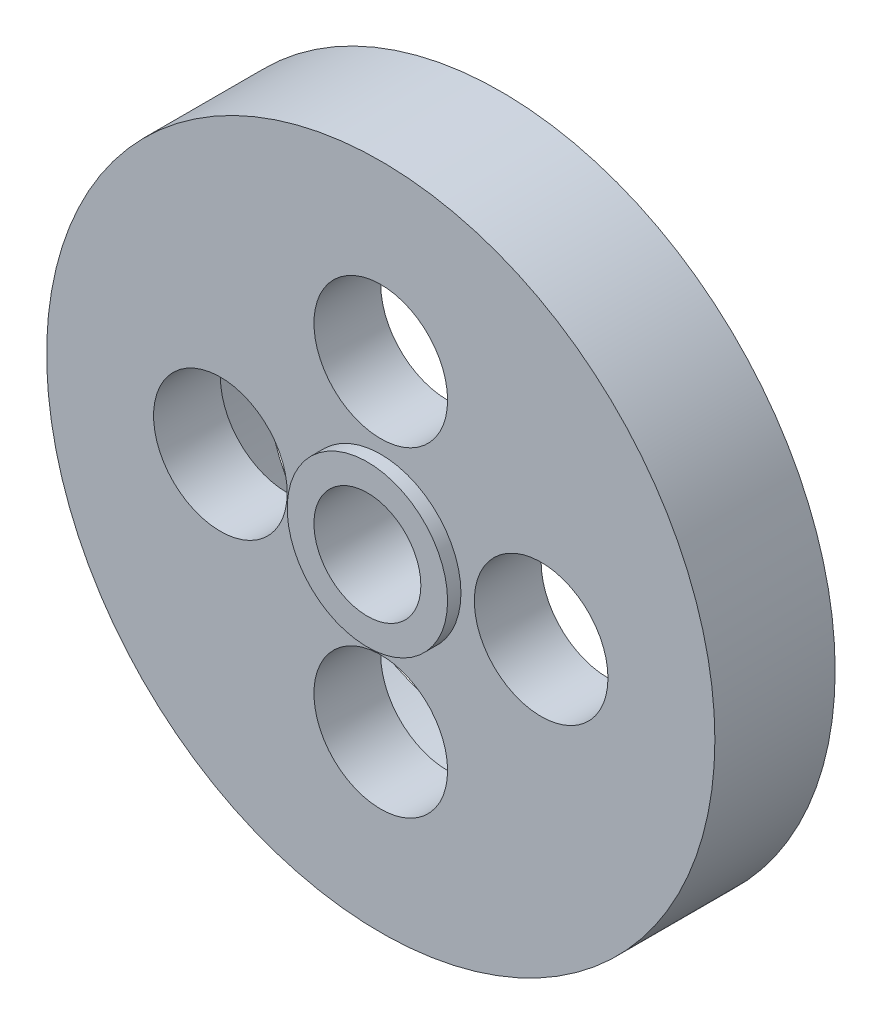
ISO-10303-21;
HEADER;
FILE_DESCRIPTION(('STEP AP214'),'2;1');
FILE_NAME('part.step','',(''),(''),'','','');
FILE_SCHEMA(('AUTOMOTIVE_DESIGN { 1 0 10303 214 1 1 1 1 }'));
ENDSEC;
DATA;
#1=APPLICATION_CONTEXT('core data for automotive mechanical design processes');
#2=APPLICATION_PROTOCOL_DEFINITION('international standard','automotive_design',2000,#1);
#3=PRODUCT_CONTEXT('',#1,'mechanical');
#4=PRODUCT('Part','Part','',(#3));
#5=PRODUCT_RELATED_PRODUCT_CATEGORY('part','',(#4));
#6=PRODUCT_DEFINITION_FORMATION('','',#4);
#7=PRODUCT_DEFINITION_CONTEXT('part definition',#1,'design');
#8=PRODUCT_DEFINITION('design','',#6,#7);
#9=PRODUCT_DEFINITION_SHAPE('','',#8);
#10=(LENGTH_UNIT() NAMED_UNIT(*) SI_UNIT(.MILLI.,.METRE.));
#11=(NAMED_UNIT(*) PLANE_ANGLE_UNIT() SI_UNIT($,.RADIAN.));
#12=(NAMED_UNIT(*) SI_UNIT($,.STERADIAN.) SOLID_ANGLE_UNIT());
#13=UNCERTAINTY_MEASURE_WITH_UNIT(LENGTH_MEASURE(1.E-05),#10,'distance_accuracy_value','');
#14=(GEOMETRIC_REPRESENTATION_CONTEXT(3) GLOBAL_UNCERTAINTY_ASSIGNED_CONTEXT((#13)) GLOBAL_UNIT_ASSIGNED_CONTEXT((#10,
#11,#12)) REPRESENTATION_CONTEXT('',''));
#15=CARTESIAN_POINT('',(0.,0.,0.));
#16=DIRECTION('',(0.,0.,1.));
#17=DIRECTION('',(1.,0.,0.));
#18=AXIS2_PLACEMENT_3D('',#15,#16,#17);
#19=CARTESIAN_POINT('',(0.,0.,-9.));
#20=DIRECTION('',(0.,0.,1.));
#21=DIRECTION('',(1.,0.,0.));
#22=AXIS2_PLACEMENT_3D('',#19,#20,#21);
#23=CYLINDRICAL_SURFACE('',#22,4.);
#24=CARTESIAN_POINT('',(0.,0.,1.));
#25=DIRECTION('',(0.,0.,1.));
#26=DIRECTION('',(1.,0.,0.));
#27=AXIS2_PLACEMENT_3D('',#24,#25,#26);
#28=CIRCLE('',#27,4.);
#29=CARTESIAN_POINT('',(4.,0.,1.));
#30=VERTEX_POINT('',#29);
#31=EDGE_CURVE('E88',#30,#30,#28,.T.);
#32=ORIENTED_EDGE('',*,*,#31,.T.);
#33=EDGE_LOOP('',(#32));
#34=FACE_BOUND('',#33,.T.);
#35=CARTESIAN_POINT('',(0.,0.,-5.));
#36=DIRECTION('',(0.,0.,-1.));
#37=DIRECTION('',(-1.,0.,0.));
#38=AXIS2_PLACEMENT_3D('',#35,#36,#37);
#39=CIRCLE('',#38,4.);
#40=CARTESIAN_POINT('',(-4.,0.,-5.));
#41=VERTEX_POINT('',#40);
#42=EDGE_CURVE('E93',#41,#41,#39,.T.);
#43=ORIENTED_EDGE('',*,*,#42,.T.);
#44=EDGE_LOOP('',(#43));
#45=FACE_BOUND('',#44,.T.);
#46=ADVANCED_FACE('F43',(#34,#45),#23,.F.);
#47=CARTESIAN_POINT('',(0.,0.,0.));
#48=DIRECTION('',(0.,0.,1.));
#49=DIRECTION('',(1.,0.,0.));
#50=AXIS2_PLACEMENT_3D('',#47,#48,#49);
#51=PLANE('',#50);
#52=CARTESIAN_POINT('',(0.,0.,0.));
#53=DIRECTION('',(0.,0.,1.));
#54=DIRECTION('',(1.,0.,0.));
#55=AXIS2_PLACEMENT_3D('',#52,#53,#54);
#56=CIRCLE('',#55,25.);
#57=CARTESIAN_POINT('',(25.,0.,0.));
#58=VERTEX_POINT('',#57);
#59=EDGE_CURVE('E51',#58,#58,#56,.T.);
#60=ORIENTED_EDGE('',*,*,#59,.T.);
#61=EDGE_LOOP('',(#60));
#62=FACE_BOUND('',#61,.T.);
#63=CARTESIAN_POINT('',(0.,12.,0.));
#64=DIRECTION('',(0.,0.,1.));
#65=DIRECTION('',(1.,0.,0.));
#66=AXIS2_PLACEMENT_3D('',#63,#64,#65);
#67=CIRCLE('',#66,5.);
#68=CARTESIAN_POINT('',(5.,12.,0.));
#69=VERTEX_POINT('',#68);
#70=EDGE_CURVE('E56',#69,#69,#67,.T.);
#71=ORIENTED_EDGE('',*,*,#70,.F.);
#72=EDGE_LOOP('',(#71));
#73=FACE_BOUND('',#72,.T.);
#74=CARTESIAN_POINT('',(12.,0.,0.));
#75=DIRECTION('',(0.,0.,1.));
#76=DIRECTION('',(1.,0.,0.));
#77=AXIS2_PLACEMENT_3D('',#74,#75,#76);
#78=CIRCLE('',#77,5.);
#79=CARTESIAN_POINT('',(17.,0.,0.));
#80=VERTEX_POINT('',#79);
#81=EDGE_CURVE('E60',#80,#80,#78,.T.);
#82=ORIENTED_EDGE('',*,*,#81,.F.);
#83=EDGE_LOOP('',(#82));
#84=FACE_BOUND('',#83,.T.);
#85=CARTESIAN_POINT('',(0.,-12.,0.));
#86=DIRECTION('',(0.,0.,1.));
#87=DIRECTION('',(1.,0.,0.));
#88=AXIS2_PLACEMENT_3D('',#85,#86,#87);
#89=CIRCLE('',#88,5.);
#90=CARTESIAN_POINT('',(4.99999999999992,-12.,0.));
#91=VERTEX_POINT('',#90);
#92=EDGE_CURVE('E63',#91,#91,#89,.T.);
#93=ORIENTED_EDGE('',*,*,#92,.F.);
#94=EDGE_LOOP('',(#93));
#95=FACE_BOUND('',#94,.T.);
#96=CARTESIAN_POINT('',(-12.,1.25693328198353E-13,0.));
#97=DIRECTION('',(0.,0.,1.));
#98=DIRECTION('',(1.,0.,0.));
#99=AXIS2_PLACEMENT_3D('',#96,#97,#98);
#100=CIRCLE('',#99,5.);
#101=CARTESIAN_POINT('',(-7.,1.25693328198353E-13,0.));
#102=VERTEX_POINT('',#101);
#103=EDGE_CURVE('E66',#102,#102,#100,.T.);
#104=ORIENTED_EDGE('',*,*,#103,.F.);
#105=EDGE_LOOP('',(#104));
#106=FACE_BOUND('',#105,.T.);
#107=CARTESIAN_POINT('',(0.,0.,0.));
#108=DIRECTION('',(0.,0.,1.));
#109=DIRECTION('',(1.,0.,0.));
#110=AXIS2_PLACEMENT_3D('',#107,#108,#109);
#111=CIRCLE('',#110,6.);
#112=CARTESIAN_POINT('',(6.,0.,0.));
#113=VERTEX_POINT('',#112);
#114=EDGE_CURVE('E85',#113,#113,#111,.T.);
#115=ORIENTED_EDGE('',*,*,#114,.F.);
#116=EDGE_LOOP('',(#115));
#117=FACE_BOUND('',#116,.T.);
#118=ADVANCED_FACE('F117',(#62,#73,#84,#95,#106,#117),#51,.T.);
#119=CARTESIAN_POINT('',(0.,12.,-9.));
#120=DIRECTION('',(0.,0.,1.));
#121=DIRECTION('',(1.,0.,0.));
#122=AXIS2_PLACEMENT_3D('',#119,#120,#121);
#123=CYLINDRICAL_SURFACE('',#122,5.);
#124=ORIENTED_EDGE('',*,*,#70,.T.);
#125=EDGE_LOOP('',(#124));
#126=FACE_BOUND('',#125,.T.);
#127=CARTESIAN_POINT('',(0.,12.,-5.));
#128=DIRECTION('',(0.,0.,-1.));
#129=DIRECTION('',(-1.,0.,0.));
#130=AXIS2_PLACEMENT_3D('',#127,#128,#129);
#131=CIRCLE('',#130,5.);
#132=CARTESIAN_POINT('',(-5.,12.,-5.));
#133=VERTEX_POINT('',#132);
#134=EDGE_CURVE('E69',#133,#133,#131,.F.);
#135=ORIENTED_EDGE('',*,*,#134,.F.);
#136=EDGE_LOOP('',(#135));
#137=FACE_BOUND('',#136,.T.);
#138=ADVANCED_FACE('F124',(#126,#137),#123,.F.);
#139=CARTESIAN_POINT('',(12.,0.,-9.));
#140=DIRECTION('',(0.,0.,1.));
#141=DIRECTION('',(1.,0.,0.));
#142=AXIS2_PLACEMENT_3D('',#139,#140,#141);
#143=CYLINDRICAL_SURFACE('',#142,5.);
#144=ORIENTED_EDGE('',*,*,#81,.T.);
#145=EDGE_LOOP('',(#144));
#146=FACE_BOUND('',#145,.T.);
#147=CARTESIAN_POINT('',(12.,0.,-5.));
#148=DIRECTION('',(0.,0.,-1.));
#149=DIRECTION('',(-1.,0.,0.));
#150=AXIS2_PLACEMENT_3D('',#147,#148,#149);
#151=CIRCLE('',#150,5.);
#152=CARTESIAN_POINT('',(7.,0.,-5.));
#153=VERTEX_POINT('',#152);
#154=EDGE_CURVE('E72',#153,#153,#151,.F.);
#155=ORIENTED_EDGE('',*,*,#154,.F.);
#156=EDGE_LOOP('',(#155));
#157=FACE_BOUND('',#156,.T.);
#158=ADVANCED_FACE('F129',(#146,#157),#143,.F.);
#159=CARTESIAN_POINT('',(0.,-12.,-9.));
#160=DIRECTION('',(0.,0.,1.));
#161=DIRECTION('',(1.,0.,0.));
#162=AXIS2_PLACEMENT_3D('',#159,#160,#161);
#163=CYLINDRICAL_SURFACE('',#162,5.);
#164=ORIENTED_EDGE('',*,*,#92,.T.);
#165=EDGE_LOOP('',(#164));
#166=FACE_BOUND('',#165,.T.);
#167=CARTESIAN_POINT('',(0.,-12.,-5.));
#168=DIRECTION('',(0.,0.,-1.));
#169=DIRECTION('',(-1.,0.,0.));
#170=AXIS2_PLACEMENT_3D('',#167,#168,#169);
#171=CIRCLE('',#170,5.);
#172=CARTESIAN_POINT('',(-5.00000000000008,-12.,-5.));
#173=VERTEX_POINT('',#172);
#174=EDGE_CURVE('E75',#173,#173,#171,.F.);
#175=ORIENTED_EDGE('',*,*,#174,.F.);
#176=EDGE_LOOP('',(#175));
#177=FACE_BOUND('',#176,.T.);
#178=ADVANCED_FACE('F133',(#166,#177),#163,.F.);
#179=CARTESIAN_POINT('',(-12.,1.25693328198353E-13,-9.));
#180=DIRECTION('',(0.,0.,1.));
#181=DIRECTION('',(1.,0.,0.));
#182=AXIS2_PLACEMENT_3D('',#179,#180,#181);
#183=CYLINDRICAL_SURFACE('',#182,5.);
#184=ORIENTED_EDGE('',*,*,#103,.T.);
#185=EDGE_LOOP('',(#184));
#186=FACE_BOUND('',#185,.T.);
#187=CARTESIAN_POINT('',(-12.,1.25693328198353E-13,-5.));
#188=DIRECTION('',(0.,0.,-1.));
#189=DIRECTION('',(-1.,0.,0.));
#190=AXIS2_PLACEMENT_3D('',#187,#188,#189);
#191=CIRCLE('',#190,5.);
#192=CARTESIAN_POINT('',(-17.,1.25693328198353E-13,-5.));
#193=VERTEX_POINT('',#192);
#194=EDGE_CURVE('E47',#193,#193,#191,.F.);
#195=ORIENTED_EDGE('',*,*,#194,.F.);
#196=EDGE_LOOP('',(#195));
#197=FACE_BOUND('',#196,.T.);
#198=ADVANCED_FACE('F137',(#186,#197),#183,.F.);
#199=CARTESIAN_POINT('',(0.,0.,-9.));
#200=DIRECTION('',(0.,0.,1.));
#201=DIRECTION('',(1.,0.,0.));
#202=AXIS2_PLACEMENT_3D('',#199,#200,#201);
#203=CYLINDRICAL_SURFACE('',#202,25.);
#204=CARTESIAN_POINT('',(0.,0.,-9.));
#205=DIRECTION('',(0.,0.,1.));
#206=DIRECTION('',(1.,0.,0.));
#207=AXIS2_PLACEMENT_3D('',#204,#205,#206);
#208=CIRCLE('',#207,25.);
#209=CARTESIAN_POINT('',(25.,0.,-9.));
#210=VERTEX_POINT('',#209);
#211=EDGE_CURVE('E10',#210,#210,#208,.T.);
#212=ORIENTED_EDGE('',*,*,#211,.T.);
#213=EDGE_LOOP('',(#212));
#214=FACE_BOUND('',#213,.T.);
#215=ORIENTED_EDGE('',*,*,#59,.F.);
#216=EDGE_LOOP('',(#215));
#217=FACE_BOUND('',#216,.T.);
#218=ADVANCED_FACE('F45',(#214,#217),#203,.T.);
#219=CARTESIAN_POINT('',(0.,0.,-9.));
#220=DIRECTION('',(0.,0.,1.));
#221=DIRECTION('',(1.,0.,0.));
#222=AXIS2_PLACEMENT_3D('',#219,#220,#221);
#223=PLANE('',#222);
#224=CARTESIAN_POINT('',(0.,0.,-9.));
#225=DIRECTION('',(0.,0.,-1.));
#226=DIRECTION('',(-1.,0.,0.));
#227=AXIS2_PLACEMENT_3D('',#224,#225,#226);
#228=CIRCLE('',#227,18.);
#229=CARTESIAN_POINT('',(-18.,0.,-9.));
#230=VERTEX_POINT('',#229);
#231=EDGE_CURVE('E78',#230,#230,#228,.T.);
#232=ORIENTED_EDGE('',*,*,#231,.F.);
#233=EDGE_LOOP('',(#232));
#234=FACE_BOUND('',#233,.T.);
#235=ORIENTED_EDGE('',*,*,#211,.F.);
#236=EDGE_LOOP('',(#235));
#237=FACE_BOUND('',#236,.T.);
#238=ADVANCED_FACE('F101',(#234,#237),#223,.F.);
#239=CARTESIAN_POINT('',(0.,0.,-5.));
#240=DIRECTION('',(0.,0.,-1.));
#241=DIRECTION('',(-1.,0.,0.));
#242=AXIS2_PLACEMENT_3D('',#239,#240,#241);
#243=PLANE('',#242);
#244=CARTESIAN_POINT('',(0.,0.,-5.));
#245=DIRECTION('',(0.,0.,-1.));
#246=DIRECTION('',(-1.,0.,0.));
#247=AXIS2_PLACEMENT_3D('',#244,#245,#246);
#248=CIRCLE('',#247,18.);
#249=CARTESIAN_POINT('',(-18.,0.,-5.));
#250=VERTEX_POINT('',#249);
#251=EDGE_CURVE('E81',#250,#250,#248,.T.);
#252=ORIENTED_EDGE('',*,*,#251,.T.);
#253=EDGE_LOOP('',(#252));
#254=FACE_BOUND('',#253,.T.);
#255=ORIENTED_EDGE('',*,*,#194,.T.);
#256=EDGE_LOOP('',(#255));
#257=FACE_BOUND('',#256,.T.);
#258=ORIENTED_EDGE('',*,*,#174,.T.);
#259=EDGE_LOOP('',(#258));
#260=FACE_BOUND('',#259,.T.);
#261=ORIENTED_EDGE('',*,*,#154,.T.);
#262=EDGE_LOOP('',(#261));
#263=FACE_BOUND('',#262,.T.);
#264=ORIENTED_EDGE('',*,*,#134,.T.);
#265=EDGE_LOOP('',(#264));
#266=FACE_BOUND('',#265,.T.);
#267=ORIENTED_EDGE('',*,*,#42,.F.);
#268=EDGE_LOOP('',(#267));
#269=FACE_BOUND('',#268,.T.);
#270=ADVANCED_FACE('F98',(#254,#257,#260,#263,#266,#269),#243,.T.);
#271=CARTESIAN_POINT('',(0.,0.,-5.));
#272=DIRECTION('',(0.,0.,-1.));
#273=DIRECTION('',(-1.,0.,0.));
#274=AXIS2_PLACEMENT_3D('',#271,#272,#273);
#275=CYLINDRICAL_SURFACE('',#274,18.);
#276=ORIENTED_EDGE('',*,*,#251,.F.);
#277=EDGE_LOOP('',(#276));
#278=FACE_BOUND('',#277,.T.);
#279=ORIENTED_EDGE('',*,*,#231,.T.);
#280=EDGE_LOOP('',(#279));
#281=FACE_BOUND('',#280,.T.);
#282=ADVANCED_FACE('F100',(#278,#281),#275,.F.);
#283=CARTESIAN_POINT('',(0.,0.,1.));
#284=DIRECTION('',(0.,0.,1.));
#285=DIRECTION('',(1.,0.,0.));
#286=AXIS2_PLACEMENT_3D('',#283,#284,#285);
#287=PLANE('',#286);
#288=CARTESIAN_POINT('',(0.,0.,1.));
#289=DIRECTION('',(0.,0.,1.));
#290=DIRECTION('',(1.,0.,0.));
#291=AXIS2_PLACEMENT_3D('',#288,#289,#290);
#292=CIRCLE('',#291,6.);
#293=CARTESIAN_POINT('',(6.,0.,1.));
#294=VERTEX_POINT('',#293);
#295=EDGE_CURVE('E82',#294,#294,#292,.T.);
#296=ORIENTED_EDGE('',*,*,#295,.T.);
#297=EDGE_LOOP('',(#296));
#298=FACE_BOUND('',#297,.T.);
#299=ORIENTED_EDGE('',*,*,#31,.F.);
#300=EDGE_LOOP('',(#299));
#301=FACE_BOUND('',#300,.T.);
#302=ADVANCED_FACE('F108',(#298,#301),#287,.T.);
#303=CARTESIAN_POINT('',(0.,0.,1.));
#304=DIRECTION('',(0.,0.,-1.));
#305=DIRECTION('',(-1.,0.,0.));
#306=AXIS2_PLACEMENT_3D('',#303,#304,#305);
#307=CYLINDRICAL_SURFACE('',#306,6.);
#308=ORIENTED_EDGE('',*,*,#295,.F.);
#309=EDGE_LOOP('',(#308));
#310=FACE_BOUND('',#309,.T.);
#311=ORIENTED_EDGE('',*,*,#114,.T.);
#312=EDGE_LOOP('',(#311));
#313=FACE_BOUND('',#312,.T.);
#314=ADVANCED_FACE('F161',(#310,#313),#307,.T.);
#315=CLOSED_SHELL('',(#46,#118,#138,#158,#178,#198,#218,#238,#270,#282,#302,#314));
#316=MANIFOLD_SOLID_BREP('B2',#315);
#317=ADVANCED_BREP_SHAPE_REPRESENTATION('',(#18,#316),#14);
#318=SHAPE_DEFINITION_REPRESENTATION(#9,#317);
ENDSEC;
END-ISO-10303-21;
